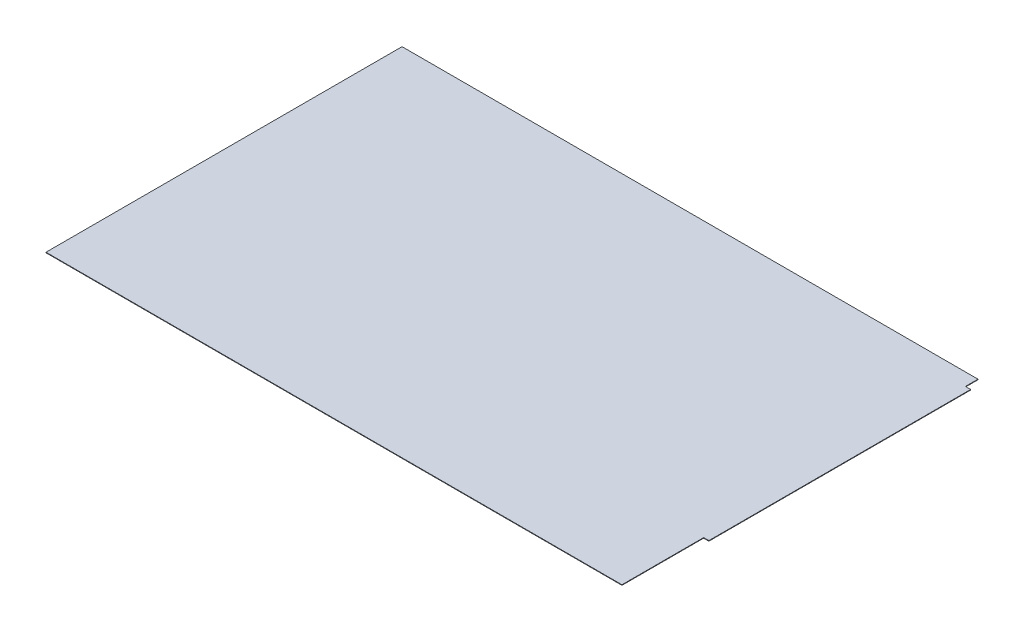
ISO-10303-21;
HEADER;
FILE_DESCRIPTION(('STEP AP214'),'2;1');
FILE_NAME('part.step','',(''),(''),'','','');
FILE_SCHEMA(('AUTOMOTIVE_DESIGN { 1 0 10303 214 1 1 1 1 }'));
ENDSEC;
DATA;
#1=APPLICATION_CONTEXT('core data for automotive mechanical design processes');
#2=APPLICATION_PROTOCOL_DEFINITION('international standard','automotive_design',2000,#1);
#3=PRODUCT_CONTEXT('',#1,'mechanical');
#4=PRODUCT('Part','Part','',(#3));
#5=PRODUCT_RELATED_PRODUCT_CATEGORY('part','',(#4));
#6=PRODUCT_DEFINITION_FORMATION('','',#4);
#7=PRODUCT_DEFINITION_CONTEXT('part definition',#1,'design');
#8=PRODUCT_DEFINITION('design','',#6,#7);
#9=PRODUCT_DEFINITION_SHAPE('','',#8);
#10=(LENGTH_UNIT() NAMED_UNIT(*) SI_UNIT(.MILLI.,.METRE.));
#11=(NAMED_UNIT(*) PLANE_ANGLE_UNIT() SI_UNIT($,.RADIAN.));
#12=(NAMED_UNIT(*) SI_UNIT($,.STERADIAN.) SOLID_ANGLE_UNIT());
#13=UNCERTAINTY_MEASURE_WITH_UNIT(LENGTH_MEASURE(1.E-05),#10,'distance_accuracy_value','');
#14=(GEOMETRIC_REPRESENTATION_CONTEXT(3) GLOBAL_UNCERTAINTY_ASSIGNED_CONTEXT((#13)) GLOBAL_UNIT_ASSIGNED_CONTEXT((#10,
#11,#12)) REPRESENTATION_CONTEXT('',''));
#15=CARTESIAN_POINT('',(0.,0.,0.));
#16=DIRECTION('',(0.,0.,1.));
#17=DIRECTION('',(1.,0.,0.));
#18=AXIS2_PLACEMENT_3D('',#15,#16,#17);
#19=CARTESIAN_POINT('',(2750.,5.,1700.));
#20=DIRECTION('',(-1.,0.,0.));
#21=DIRECTION('',(0.,0.,1.));
#22=AXIS2_PLACEMENT_3D('',#19,#20,#21);
#23=PLANE('',#22);
#24=DIRECTION('',(0.,1.,0.));
#25=VECTOR('',#24,1.);
#26=CARTESIAN_POINT('',(2750.,0.,-1580.));
#27=LINE('',#26,#25);
#28=CARTESIAN_POINT('',(2750.,0.,-1580.));
#29=VERTEX_POINT('',#28);
#30=CARTESIAN_POINT('',(2750.,5.,-1580.));
#31=VERTEX_POINT('',#30);
#32=EDGE_CURVE('E149',#29,#31,#27,.T.);
#33=ORIENTED_EDGE('',*,*,#32,.F.);
#34=DIRECTION('',(0.,0.,-1.));
#35=VECTOR('',#34,1.);
#36=CARTESIAN_POINT('',(2750.,0.,1700.));
#37=LINE('',#36,#35);
#38=CARTESIAN_POINT('',(2750.,0.,-1700.));
#39=VERTEX_POINT('',#38);
#40=EDGE_CURVE('E129',#29,#39,#37,.T.);
#41=ORIENTED_EDGE('',*,*,#40,.T.);
#42=DIRECTION('',(0.,-1.,0.));
#43=VECTOR('',#42,1.);
#44=CARTESIAN_POINT('',(2750.,5.,-1700.));
#45=LINE('',#44,#43);
#46=CARTESIAN_POINT('',(2750.,5.,-1700.));
#47=VERTEX_POINT('',#46);
#48=EDGE_CURVE('E139',#47,#39,#45,.T.);
#49=ORIENTED_EDGE('',*,*,#48,.F.);
#50=DIRECTION('',(0.,0.,-1.));
#51=VECTOR('',#50,1.);
#52=CARTESIAN_POINT('',(2750.,5.,1700.));
#53=LINE('',#52,#51);
#54=EDGE_CURVE('E156',#31,#47,#53,.T.);
#55=ORIENTED_EDGE('',*,*,#54,.F.);
#56=EDGE_LOOP('',(#33,#41,#49,#55));
#57=FACE_BOUND('',#56,.T.);
#58=ADVANCED_FACE('F33',(#57),#23,.F.);
#59=CARTESIAN_POINT('',(-2750.,5.,1700.));
#60=DIRECTION('',(1.,0.,0.));
#61=DIRECTION('',(0.,0.,-1.));
#62=AXIS2_PLACEMENT_3D('',#59,#60,#61);
#63=PLANE('',#62);
#64=DIRECTION('',(0.,0.,1.));
#65=VECTOR('',#64,1.);
#66=CARTESIAN_POINT('',(-2750.,0.,1700.));
#67=LINE('',#66,#65);
#68=CARTESIAN_POINT('',(-2750.,0.,-1700.));
#69=VERTEX_POINT('',#68);
#70=CARTESIAN_POINT('',(-2750.,0.,1700.));
#71=VERTEX_POINT('',#70);
#72=EDGE_CURVE('E146',#69,#71,#67,.T.);
#73=ORIENTED_EDGE('',*,*,#72,.T.);
#74=DIRECTION('',(0.,-1.,0.));
#75=VECTOR('',#74,1.);
#76=CARTESIAN_POINT('',(-2750.,5.,1700.));
#77=LINE('',#76,#75);
#78=CARTESIAN_POINT('',(-2750.,5.,1700.));
#79=VERTEX_POINT('',#78);
#80=EDGE_CURVE('E11',#79,#71,#77,.T.);
#81=ORIENTED_EDGE('',*,*,#80,.F.);
#82=DIRECTION('',(0.,0.,1.));
#83=VECTOR('',#82,1.);
#84=CARTESIAN_POINT('',(-2750.,5.,1700.));
#85=LINE('',#84,#83);
#86=CARTESIAN_POINT('',(-2750.,5.,-1700.));
#87=VERTEX_POINT('',#86);
#88=EDGE_CURVE('E131',#87,#79,#85,.T.);
#89=ORIENTED_EDGE('',*,*,#88,.F.);
#90=DIRECTION('',(0.,-1.,0.));
#91=VECTOR('',#90,1.);
#92=CARTESIAN_POINT('',(-2750.,5.,-1700.));
#93=LINE('',#92,#91);
#94=EDGE_CURVE('E137',#87,#69,#93,.T.);
#95=ORIENTED_EDGE('',*,*,#94,.T.);
#96=EDGE_LOOP('',(#73,#81,#89,#95));
#97=FACE_BOUND('',#96,.T.);
#98=ADVANCED_FACE('F35',(#97),#63,.F.);
#99=CARTESIAN_POINT('',(2750.,5.,1700.));
#100=DIRECTION('',(0.,0.,-1.));
#101=DIRECTION('',(-1.,0.,0.));
#102=AXIS2_PLACEMENT_3D('',#99,#100,#101);
#103=PLANE('',#102);
#104=DIRECTION('',(1.,0.,0.));
#105=VECTOR('',#104,1.);
#106=CARTESIAN_POINT('',(2750.,0.,1700.));
#107=LINE('',#106,#105);
#108=CARTESIAN_POINT('',(2750.,0.,1700.));
#109=VERTEX_POINT('',#108);
#110=EDGE_CURVE('E133',#71,#109,#107,.T.);
#111=ORIENTED_EDGE('',*,*,#110,.T.);
#112=DIRECTION('',(0.,-1.,0.));
#113=VECTOR('',#112,1.);
#114=CARTESIAN_POINT('',(2750.,5.,1700.));
#115=LINE('',#114,#113);
#116=CARTESIAN_POINT('',(2750.,5.,1700.));
#117=VERTEX_POINT('',#116);
#118=EDGE_CURVE('E41',#117,#109,#115,.T.);
#119=ORIENTED_EDGE('',*,*,#118,.F.);
#120=DIRECTION('',(1.,0.,0.));
#121=VECTOR('',#120,1.);
#122=CARTESIAN_POINT('',(2750.,5.,1700.));
#123=LINE('',#122,#121);
#124=EDGE_CURVE('E85',#79,#117,#123,.T.);
#125=ORIENTED_EDGE('',*,*,#124,.F.);
#126=ORIENTED_EDGE('',*,*,#80,.T.);
#127=EDGE_LOOP('',(#111,#119,#125,#126));
#128=FACE_BOUND('',#127,.T.);
#129=ADVANCED_FACE('F177',(#128),#103,.F.);
#130=CARTESIAN_POINT('',(2750.,0.,919.999999999999));
#131=VERTEX_POINT('',#130);
#132=EDGE_CURVE('E121',#109,#131,#37,.T.);
#133=ORIENTED_EDGE('',*,*,#132,.T.);
#134=DIRECTION('',(0.,1.,0.));
#135=VECTOR('',#134,1.);
#136=CARTESIAN_POINT('',(2750.,0.,919.999999999999));
#137=LINE('',#136,#135);
#138=CARTESIAN_POINT('',(2750.,5.,919.999999999999));
#139=VERTEX_POINT('',#138);
#140=EDGE_CURVE('E105',#131,#139,#137,.T.);
#141=ORIENTED_EDGE('',*,*,#140,.T.);
#142=EDGE_CURVE('E154',#117,#139,#53,.T.);
#143=ORIENTED_EDGE('',*,*,#142,.F.);
#144=ORIENTED_EDGE('',*,*,#118,.T.);
#145=EDGE_LOOP('',(#133,#141,#143,#144));
#146=FACE_BOUND('',#145,.T.);
#147=ADVANCED_FACE('F128',(#146),#23,.F.);
#148=CARTESIAN_POINT('',(2750.,5.,-1700.));
#149=DIRECTION('',(0.,0.,1.));
#150=DIRECTION('',(1.,0.,0.));
#151=AXIS2_PLACEMENT_3D('',#148,#149,#150);
#152=PLANE('',#151);
#153=DIRECTION('',(-1.,0.,0.));
#154=VECTOR('',#153,1.);
#155=CARTESIAN_POINT('',(2750.,0.,-1700.));
#156=LINE('',#155,#154);
#157=EDGE_CURVE('E78',#39,#69,#156,.T.);
#158=ORIENTED_EDGE('',*,*,#157,.T.);
#159=ORIENTED_EDGE('',*,*,#94,.F.);
#160=DIRECTION('',(-1.,0.,0.));
#161=VECTOR('',#160,1.);
#162=CARTESIAN_POINT('',(2750.,5.,-1700.));
#163=LINE('',#162,#161);
#164=EDGE_CURVE('E57',#47,#87,#163,.T.);
#165=ORIENTED_EDGE('',*,*,#164,.F.);
#166=ORIENTED_EDGE('',*,*,#48,.T.);
#167=EDGE_LOOP('',(#158,#159,#165,#166));
#168=FACE_BOUND('',#167,.T.);
#169=ADVANCED_FACE('F141',(#168),#152,.F.);
#170=CARTESIAN_POINT('',(0.,5.,0.));
#171=DIRECTION('',(0.,1.,0.));
#172=DIRECTION('',(0.,0.,1.));
#173=AXIS2_PLACEMENT_3D('',#170,#171,#172);
#174=PLANE('',#173);
#175=ORIENTED_EDGE('',*,*,#88,.T.);
#176=ORIENTED_EDGE('',*,*,#124,.T.);
#177=ORIENTED_EDGE('',*,*,#142,.T.);
#178=DIRECTION('',(1.,0.,0.));
#179=VECTOR('',#178,1.);
#180=CARTESIAN_POINT('',(2750.,5.,919.999999999999));
#181=LINE('',#180,#179);
#182=CARTESIAN_POINT('',(2800.,5.,919.999999999999));
#183=VERTEX_POINT('',#182);
#184=EDGE_CURVE('E48',#139,#183,#181,.T.);
#185=ORIENTED_EDGE('',*,*,#184,.T.);
#186=DIRECTION('',(0.,0.,-1.));
#187=VECTOR('',#186,1.);
#188=CARTESIAN_POINT('',(2800.,5.,919.999999999999));
#189=LINE('',#188,#187);
#190=CARTESIAN_POINT('',(2800.,5.,-1580.));
#191=VERTEX_POINT('',#190);
#192=EDGE_CURVE('E163',#183,#191,#189,.T.);
#193=ORIENTED_EDGE('',*,*,#192,.T.);
#194=DIRECTION('',(-1.,0.,0.));
#195=VECTOR('',#194,1.);
#196=CARTESIAN_POINT('',(2750.,5.,-1580.));
#197=LINE('',#196,#195);
#198=EDGE_CURVE('E125',#191,#31,#197,.T.);
#199=ORIENTED_EDGE('',*,*,#198,.T.);
#200=ORIENTED_EDGE('',*,*,#54,.T.);
#201=ORIENTED_EDGE('',*,*,#164,.T.);
#202=EDGE_LOOP('',(#175,#176,#177,#185,#193,#199,#200,#201));
#203=FACE_BOUND('',#202,.T.);
#204=ADVANCED_FACE('F175',(#203),#174,.T.);
#205=CARTESIAN_POINT('',(0.,0.,0.));
#206=DIRECTION('',(0.,1.,0.));
#207=DIRECTION('',(0.,0.,1.));
#208=AXIS2_PLACEMENT_3D('',#205,#206,#207);
#209=PLANE('',#208);
#210=ORIENTED_EDGE('',*,*,#72,.F.);
#211=ORIENTED_EDGE('',*,*,#157,.F.);
#212=ORIENTED_EDGE('',*,*,#40,.F.);
#213=DIRECTION('',(-1.,0.,0.));
#214=VECTOR('',#213,1.);
#215=CARTESIAN_POINT('',(2750.,0.,-1580.));
#216=LINE('',#215,#214);
#217=CARTESIAN_POINT('',(2800.,0.,-1580.));
#218=VERTEX_POINT('',#217);
#219=EDGE_CURVE('E114',#218,#29,#216,.T.);
#220=ORIENTED_EDGE('',*,*,#219,.F.);
#221=DIRECTION('',(0.,0.,-1.));
#222=VECTOR('',#221,1.);
#223=CARTESIAN_POINT('',(2800.,0.,919.999999999999));
#224=LINE('',#223,#222);
#225=CARTESIAN_POINT('',(2800.,0.,919.999999999999));
#226=VERTEX_POINT('',#225);
#227=EDGE_CURVE('E124',#226,#218,#224,.T.);
#228=ORIENTED_EDGE('',*,*,#227,.F.);
#229=DIRECTION('',(1.,0.,0.));
#230=VECTOR('',#229,1.);
#231=CARTESIAN_POINT('',(2750.,0.,919.999999999999));
#232=LINE('',#231,#230);
#233=EDGE_CURVE('E108',#131,#226,#232,.T.);
#234=ORIENTED_EDGE('',*,*,#233,.F.);
#235=ORIENTED_EDGE('',*,*,#132,.F.);
#236=ORIENTED_EDGE('',*,*,#110,.F.);
#237=EDGE_LOOP('',(#210,#211,#212,#220,#228,#234,#235,#236));
#238=FACE_BOUND('',#237,.T.);
#239=ADVANCED_FACE('F120',(#238),#209,.F.);
#240=CARTESIAN_POINT('',(2750.,0.,-1580.));
#241=DIRECTION('',(0.,0.,-1.));
#242=DIRECTION('',(-1.,0.,0.));
#243=AXIS2_PLACEMENT_3D('',#240,#241,#242);
#244=PLANE('',#243);
#245=ORIENTED_EDGE('',*,*,#198,.F.);
#246=DIRECTION('',(0.,1.,0.));
#247=VECTOR('',#246,1.);
#248=CARTESIAN_POINT('',(2800.,0.,-1580.));
#249=LINE('',#248,#247);
#250=EDGE_CURVE('E150',#218,#191,#249,.T.);
#251=ORIENTED_EDGE('',*,*,#250,.F.);
#252=ORIENTED_EDGE('',*,*,#219,.T.);
#253=ORIENTED_EDGE('',*,*,#32,.T.);
#254=EDGE_LOOP('',(#245,#251,#252,#253));
#255=FACE_BOUND('',#254,.T.);
#256=ADVANCED_FACE('F174',(#255),#244,.T.);
#257=CARTESIAN_POINT('',(2800.,0.,919.999999999999));
#258=DIRECTION('',(1.,0.,0.));
#259=DIRECTION('',(0.,0.,-1.));
#260=AXIS2_PLACEMENT_3D('',#257,#258,#259);
#261=PLANE('',#260);
#262=ORIENTED_EDGE('',*,*,#192,.F.);
#263=DIRECTION('',(0.,1.,0.));
#264=VECTOR('',#263,1.);
#265=CARTESIAN_POINT('',(2800.,0.,919.999999999999));
#266=LINE('',#265,#264);
#267=EDGE_CURVE('E113',#226,#183,#266,.T.);
#268=ORIENTED_EDGE('',*,*,#267,.F.);
#269=ORIENTED_EDGE('',*,*,#227,.T.);
#270=ORIENTED_EDGE('',*,*,#250,.T.);
#271=EDGE_LOOP('',(#262,#268,#269,#270));
#272=FACE_BOUND('',#271,.T.);
#273=ADVANCED_FACE('F170',(#272),#261,.T.);
#274=CARTESIAN_POINT('',(2750.,0.,919.999999999999));
#275=DIRECTION('',(0.,0.,1.));
#276=DIRECTION('',(1.,0.,0.));
#277=AXIS2_PLACEMENT_3D('',#274,#275,#276);
#278=PLANE('',#277);
#279=ORIENTED_EDGE('',*,*,#184,.F.);
#280=ORIENTED_EDGE('',*,*,#140,.F.);
#281=ORIENTED_EDGE('',*,*,#233,.T.);
#282=ORIENTED_EDGE('',*,*,#267,.T.);
#283=EDGE_LOOP('',(#279,#280,#281,#282));
#284=FACE_BOUND('',#283,.T.);
#285=ADVANCED_FACE('F107',(#284),#278,.T.);
#286=CLOSED_SHELL('',(#58,#98,#129,#147,#169,#204,#239,#256,#273,#285));
#287=MANIFOLD_SOLID_BREP('B2',#286);
#288=ADVANCED_BREP_SHAPE_REPRESENTATION('',(#18,#287),#14);
#289=SHAPE_DEFINITION_REPRESENTATION(#9,#288);
ENDSEC;
END-ISO-10303-21;
